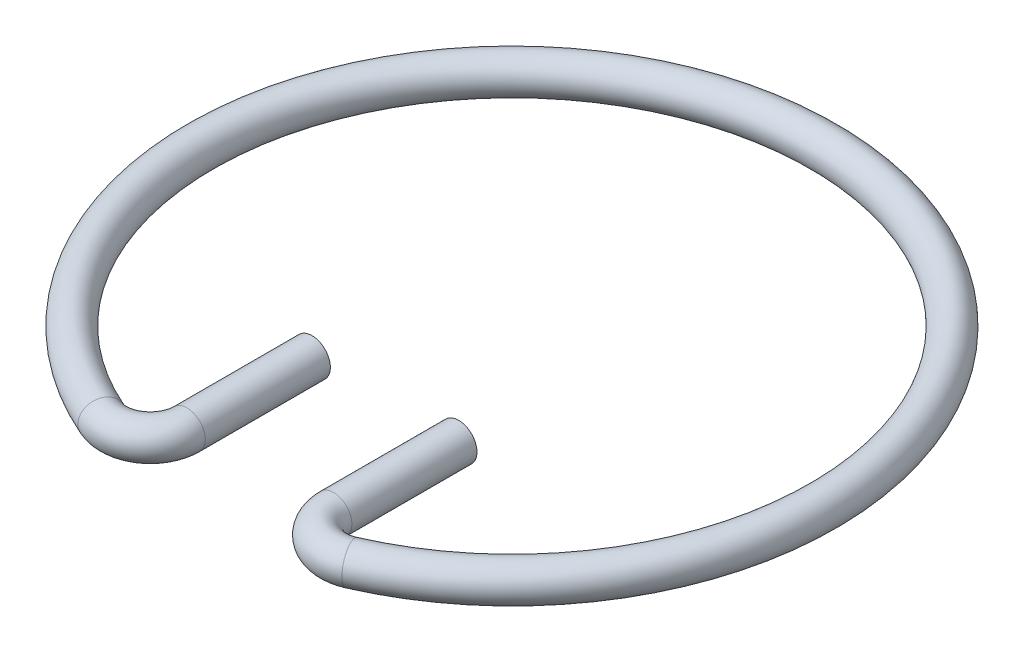
ISO-10303-21;
HEADER;
FILE_DESCRIPTION(('STEP AP214'),'2;1');
FILE_NAME('part.step','',(''),(''),'','','');
FILE_SCHEMA(('AUTOMOTIVE_DESIGN { 1 0 10303 214 1 1 1 1 }'));
ENDSEC;
DATA;
#1=APPLICATION_CONTEXT('core data for automotive mechanical design processes');
#2=APPLICATION_PROTOCOL_DEFINITION('international standard','automotive_design',2000,#1);
#3=PRODUCT_CONTEXT('',#1,'mechanical');
#4=PRODUCT('Part','Part','',(#3));
#5=PRODUCT_RELATED_PRODUCT_CATEGORY('part','',(#4));
#6=PRODUCT_DEFINITION_FORMATION('','',#4);
#7=PRODUCT_DEFINITION_CONTEXT('part definition',#1,'design');
#8=PRODUCT_DEFINITION('design','',#6,#7);
#9=PRODUCT_DEFINITION_SHAPE('','',#8);
#10=(LENGTH_UNIT() NAMED_UNIT(*) SI_UNIT(.MILLI.,.METRE.));
#11=(NAMED_UNIT(*) PLANE_ANGLE_UNIT() SI_UNIT($,.RADIAN.));
#12=(NAMED_UNIT(*) SI_UNIT($,.STERADIAN.) SOLID_ANGLE_UNIT());
#13=UNCERTAINTY_MEASURE_WITH_UNIT(LENGTH_MEASURE(1.E-05),#10,'distance_accuracy_value','');
#14=(GEOMETRIC_REPRESENTATION_CONTEXT(3) GLOBAL_UNCERTAINTY_ASSIGNED_CONTEXT((#13)) GLOBAL_UNIT_ASSIGNED_CONTEXT((#10,
#11,#12)) REPRESENTATION_CONTEXT('',''));
#15=CARTESIAN_POINT('',(0.,0.,0.));
#16=DIRECTION('',(0.,0.,1.));
#17=DIRECTION('',(1.,0.,0.));
#18=AXIS2_PLACEMENT_3D('',#15,#16,#17);
#19=CARTESIAN_POINT('',(6.35,0.,0.));
#20=DIRECTION('',(0.,0.,-1.));
#21=DIRECTION('',(-1.,0.,0.));
#22=AXIS2_PLACEMENT_3D('',#19,#20,#21);
#23=PLANE('',#22);
#24=CARTESIAN_POINT('',(6.35,0.,0.));
#25=DIRECTION('',(0.,0.,-1.));
#26=DIRECTION('',(-1.,0.,0.));
#27=AXIS2_PLACEMENT_3D('',#24,#25,#26);
#28=CIRCLE('',#27,0.79375);
#29=CARTESIAN_POINT('',(5.55625,0.,0.));
#30=VERTEX_POINT('',#29);
#31=EDGE_CURVE('E46',#30,#30,#28,.T.);
#32=ORIENTED_EDGE('',*,*,#31,.T.);
#33=EDGE_LOOP('',(#32));
#34=FACE_BOUND('',#33,.T.);
#35=ADVANCED_FACE('F34',(#34),#23,.T.);
#36=CARTESIAN_POINT('',(0.,0.,0.));
#37=DIRECTION('',(0.,0.,1.));
#38=DIRECTION('',(1.,0.,0.));
#39=AXIS2_PLACEMENT_3D('',#36,#37,#38);
#40=PLANE('',#39);
#41=CARTESIAN_POINT('',(0.,0.,0.));
#42=DIRECTION('',(0.,0.,1.));
#43=DIRECTION('',(1.,0.,0.));
#44=AXIS2_PLACEMENT_3D('',#41,#42,#43);
#45=CIRCLE('',#44,0.79375);
#46=CARTESIAN_POINT('',(0.79375,0.,0.));
#47=VERTEX_POINT('',#46);
#48=EDGE_CURVE('E11',#47,#47,#45,.T.);
#49=ORIENTED_EDGE('',*,*,#48,.F.);
#50=EDGE_LOOP('',(#49));
#51=FACE_BOUND('',#50,.T.);
#52=ADVANCED_FACE('F52',(#51),#40,.F.);
#53=CARTESIAN_POINT('',(6.35,0.,0.));
#54=DIRECTION('',(0.,0.,1.));
#55=DIRECTION('',(1.,0.,0.));
#56=AXIS2_PLACEMENT_3D('',#53,#54,#55);
#57=CYLINDRICAL_SURFACE('',#56,0.79375);
#58=CARTESIAN_POINT('',(6.35,0.,5.41656498556735));
#59=DIRECTION('',(0.,0.,-1.));
#60=DIRECTION('',(-1.,0.,0.));
#61=AXIS2_PLACEMENT_3D('',#58,#59,#60);
#62=CIRCLE('',#61,0.79375);
#63=CARTESIAN_POINT('',(5.55625,0.,5.41656498556735));
#64=VERTEX_POINT('',#63);
#65=EDGE_CURVE('E86',#64,#64,#62,.T.);
#66=ORIENTED_EDGE('',*,*,#65,.T.);
#67=EDGE_LOOP('',(#66));
#68=FACE_BOUND('',#67,.T.);
#69=ORIENTED_EDGE('',*,*,#31,.F.);
#70=EDGE_LOOP('',(#69));
#71=FACE_BOUND('',#70,.T.);
#72=ADVANCED_FACE('F54',(#68,#71),#57,.T.);
#73=CARTESIAN_POINT('',(7.9375,0.,5.41656498556735));
#74=DIRECTION('',(0.,1.,0.));
#75=DIRECTION('',(0.,0.,1.));
#76=AXIS2_PLACEMENT_3D('',#73,#74,#75);
#77=TOROIDAL_SURFACE('',#76,1.5875,0.79375);
#78=CARTESIAN_POINT('',(8.57317805659369,0.,6.87123665242736));
#79=DIRECTION('',(-0.916328609045674,0.,0.400427122263741));
#80=DIRECTION('',(0.400427122263741,0.,0.916328609045674));
#81=AXIS2_PLACEMENT_3D('',#78,#79,#80);
#82=CIRCLE('',#81,0.79375);
#83=CARTESIAN_POINT('',(8.89101708489053,0.,7.59857248585736));
#84=VERTEX_POINT('',#83);
#85=EDGE_CURVE('E83',#84,#84,#82,.T.);
#86=CARTESIAN_POINT('',(7.9375,0.,5.41656498556735));
#87=DIRECTION('',(0.,1.,0.));
#88=DIRECTION('',(0.,0.,1.));
#89=AXIS2_PLACEMENT_3D('',#86,#87,#88);
#90=CIRCLE('',#89,2.38125);
#91=EDGE_CURVE('',#64,#84,#90,.T.);
#92=ORIENTED_EDGE('',*,*,#65,.F.);
#93=ORIENTED_EDGE('',*,*,#85,.T.);
#94=ORIENTED_EDGE('',*,*,#91,.T.);
#95=ORIENTED_EDGE('',*,*,#91,.F.);
#96=EDGE_LOOP('',(#92,#94,#93,#95));
#97=FACE_BOUND('',#96,.T.);
#98=ADVANCED_FACE('F59',(#97),#77,.T.);
#99=CARTESIAN_POINT('',(3.175,0.,-5.48183514254778));
#100=DIRECTION('',(0.,1.,0.));
#101=DIRECTION('',(0.,0.,1.));
#102=AXIS2_PLACEMENT_3D('',#99,#100,#101);
#103=TOROIDAL_SURFACE('',#102,13.48105,0.79375);
#104=CARTESIAN_POINT('',(-2.22317805659369,0.,6.87123665242736));
#105=DIRECTION('',(-0.916328609045671,0.,-0.400427122263747));
#106=DIRECTION('',(-0.400427122263747,0.,0.916328609045671));
#107=AXIS2_PLACEMENT_3D('',#104,#105,#106);
#108=CIRCLE('',#107,0.79375);
#109=CARTESIAN_POINT('',(-2.54101708489054,0.,7.59857248585736));
#110=VERTEX_POINT('',#109);
#111=EDGE_CURVE('E88',#110,#110,#108,.T.);
#112=CARTESIAN_POINT('',(3.175,0.,-5.48183514254778));
#113=DIRECTION('',(0.,1.,0.));
#114=DIRECTION('',(0.,0.,1.));
#115=AXIS2_PLACEMENT_3D('',#112,#113,#114);
#116=CIRCLE('',#115,14.2748);
#117=EDGE_CURVE('',#84,#110,#116,.T.);
#118=ORIENTED_EDGE('',*,*,#85,.F.);
#119=ORIENTED_EDGE('',*,*,#111,.T.);
#120=ORIENTED_EDGE('',*,*,#117,.T.);
#121=ORIENTED_EDGE('',*,*,#117,.F.);
#122=EDGE_LOOP('',(#118,#120,#119,#121));
#123=FACE_BOUND('',#122,.T.);
#124=ADVANCED_FACE('F69',(#123),#103,.T.);
#125=CARTESIAN_POINT('',(-1.5875,0.,5.41656498556735));
#126=DIRECTION('',(0.,1.,0.));
#127=DIRECTION('',(0.,0.,1.));
#128=AXIS2_PLACEMENT_3D('',#125,#126,#127);
#129=TOROIDAL_SURFACE('',#128,1.5875,0.79375);
#130=CARTESIAN_POINT('',(0.,0.,5.41656498556735));
#131=DIRECTION('',(0.,0.,1.));
#132=DIRECTION('',(1.,0.,0.));
#133=AXIS2_PLACEMENT_3D('',#130,#131,#132);
#134=CIRCLE('',#133,0.79375);
#135=CARTESIAN_POINT('',(0.79375,0.,5.41656498556735));
#136=VERTEX_POINT('',#135);
#137=EDGE_CURVE('E41',#136,#136,#134,.T.);
#138=CARTESIAN_POINT('',(-1.5875,0.,5.41656498556735));
#139=DIRECTION('',(0.,1.,0.));
#140=DIRECTION('',(0.,0.,1.));
#141=AXIS2_PLACEMENT_3D('',#138,#139,#140);
#142=CIRCLE('',#141,2.38125);
#143=EDGE_CURVE('',#110,#136,#142,.T.);
#144=ORIENTED_EDGE('',*,*,#111,.F.);
#145=ORIENTED_EDGE('',*,*,#137,.T.);
#146=ORIENTED_EDGE('',*,*,#143,.T.);
#147=ORIENTED_EDGE('',*,*,#143,.F.);
#148=EDGE_LOOP('',(#144,#146,#145,#147));
#149=FACE_BOUND('',#148,.T.);
#150=ADVANCED_FACE('F65',(#149),#129,.T.);
#151=CARTESIAN_POINT('',(0.,0.,5.41656498556735));
#152=DIRECTION('',(0.,0.,-1.));
#153=DIRECTION('',(-1.,0.,0.));
#154=AXIS2_PLACEMENT_3D('',#151,#152,#153);
#155=CYLINDRICAL_SURFACE('',#154,0.79375);
#156=ORIENTED_EDGE('',*,*,#48,.T.);
#157=EDGE_LOOP('',(#156));
#158=FACE_BOUND('',#157,.T.);
#159=ORIENTED_EDGE('',*,*,#137,.F.);
#160=EDGE_LOOP('',(#159));
#161=FACE_BOUND('',#160,.T.);
#162=ADVANCED_FACE('F49',(#158,#161),#155,.T.);
#163=CLOSED_SHELL('',(#35,#52,#72,#98,#124,#150,#162));
#164=MANIFOLD_SOLID_BREP('B2',#163);
#165=ADVANCED_BREP_SHAPE_REPRESENTATION('',(#18,#164),#14);
#166=SHAPE_DEFINITION_REPRESENTATION(#9,#165);
ENDSEC;
END-ISO-10303-21;
